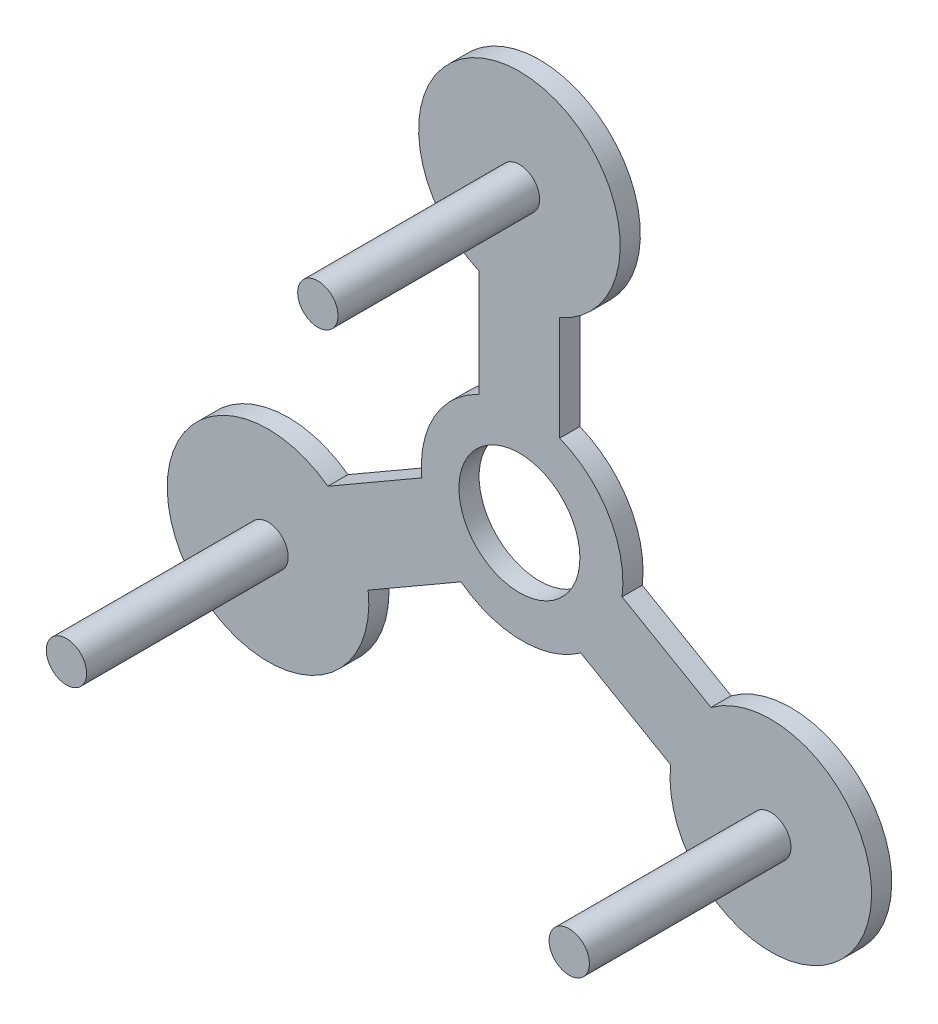
ISO-10303-21;
HEADER;
FILE_DESCRIPTION(('STEP AP214'),'2;1');
FILE_NAME('part.step','',(''),(''),'','','');
FILE_SCHEMA(('AUTOMOTIVE_DESIGN { 1 0 10303 214 1 1 1 1 }'));
ENDSEC;
DATA;
#1=APPLICATION_CONTEXT('core data for automotive mechanical design processes');
#2=APPLICATION_PROTOCOL_DEFINITION('international standard','automotive_design',2000,#1);
#3=PRODUCT_CONTEXT('',#1,'mechanical');
#4=PRODUCT('Part','Part','',(#3));
#5=PRODUCT_RELATED_PRODUCT_CATEGORY('part','',(#4));
#6=PRODUCT_DEFINITION_FORMATION('','',#4);
#7=PRODUCT_DEFINITION_CONTEXT('part definition',#1,'design');
#8=PRODUCT_DEFINITION('design','',#6,#7);
#9=PRODUCT_DEFINITION_SHAPE('','',#8);
#10=(LENGTH_UNIT() NAMED_UNIT(*) SI_UNIT(.MILLI.,.METRE.));
#11=(NAMED_UNIT(*) PLANE_ANGLE_UNIT() SI_UNIT($,.RADIAN.));
#12=(NAMED_UNIT(*) SI_UNIT($,.STERADIAN.) SOLID_ANGLE_UNIT());
#13=UNCERTAINTY_MEASURE_WITH_UNIT(LENGTH_MEASURE(1.E-05),#10,'distance_accuracy_value','');
#14=(GEOMETRIC_REPRESENTATION_CONTEXT(3) GLOBAL_UNCERTAINTY_ASSIGNED_CONTEXT((#13)) GLOBAL_UNIT_ASSIGNED_CONTEXT((#10,
#11,#12)) REPRESENTATION_CONTEXT('',''));
#15=CARTESIAN_POINT('',(0.,0.,0.));
#16=DIRECTION('',(0.,0.,1.));
#17=DIRECTION('',(1.,0.,0.));
#18=AXIS2_PLACEMENT_3D('',#15,#16,#17);
#19=CARTESIAN_POINT('',(0.116362959029001,28.8009743811257,33.5063190123971));
#20=DIRECTION('',(0.,0.,-1.));
#21=DIRECTION('',(-1.,0.,0.));
#22=AXIS2_PLACEMENT_3D('',#19,#20,#21);
#23=CYLINDRICAL_SURFACE('',#22,1.9999999999984);
#24=CARTESIAN_POINT('',(0.116362959029001,28.8009743811257,15.5063190123971));
#25=DIRECTION('',(0.,0.,1.));
#26=DIRECTION('',(1.,0.,0.));
#27=AXIS2_PLACEMENT_3D('',#24,#25,#26);
#28=CIRCLE('',#27,1.9999999999984);
#29=CARTESIAN_POINT('',(-1.8836370409694,28.8009743811257,15.5063190123971));
#30=VERTEX_POINT('',#29);
#31=EDGE_CURVE('E248',#30,#30,#28,.T.);
#32=CARTESIAN_POINT('',(0.116362959029001,28.8009743811257,35.5063190123971));
#33=DIRECTION('',(0.,0.,1.));
#34=DIRECTION('',(1.,0.,0.));
#35=AXIS2_PLACEMENT_3D('',#32,#33,#34);
#36=CIRCLE('',#35,1.9999999999984);
#37=CARTESIAN_POINT('',(-1.8836370409694,28.8009743811257,35.5063190123971));
#38=VERTEX_POINT('',#37);
#39=EDGE_CURVE('E236',#38,#38,#36,.T.);
#40=CARTESIAN_POINT('',(-1.8836370409694,28.8009743811257,15.5063190123971));
#41=CARTESIAN_POINT('',(-1.8836370409694,28.8009743811257,15.7146523457304));
#42=CARTESIAN_POINT('',(-1.8836370409694,28.8009743811257,15.9229856790638));
#43=CARTESIAN_POINT('',(-1.8836370409694,28.8009743811257,16.3396523457304));
#44=CARTESIAN_POINT('',(-1.8836370409694,28.8009743811257,16.5479856790638));
#45=CARTESIAN_POINT('',(-1.8836370409694,28.8009743811257,16.9646523457304));
#46=CARTESIAN_POINT('',(-1.8836370409694,28.8009743811257,17.1729856790638));
#47=CARTESIAN_POINT('',(-1.8836370409694,28.8009743811257,17.5896523457304));
#48=CARTESIAN_POINT('',(-1.8836370409694,28.8009743811257,17.7979856790638));
#49=CARTESIAN_POINT('',(-1.8836370409694,28.8009743811257,18.2146523457304));
#50=CARTESIAN_POINT('',(-1.8836370409694,28.8009743811257,18.4229856790638));
#51=CARTESIAN_POINT('',(-1.8836370409694,28.8009743811257,18.8396523457304));
#52=CARTESIAN_POINT('',(-1.8836370409694,28.8009743811257,19.0479856790638));
#53=CARTESIAN_POINT('',(-1.8836370409694,28.8009743811257,19.4646523457304));
#54=CARTESIAN_POINT('',(-1.8836370409694,28.8009743811257,19.6729856790638));
#55=CARTESIAN_POINT('',(-1.8836370409694,28.8009743811257,20.0896523457304));
#56=CARTESIAN_POINT('',(-1.8836370409694,28.8009743811257,20.2979856790638));
#57=CARTESIAN_POINT('',(-1.8836370409694,28.8009743811257,20.7146523457304));
#58=CARTESIAN_POINT('',(-1.8836370409694,28.8009743811257,20.9229856790638));
#59=CARTESIAN_POINT('',(-1.8836370409694,28.8009743811257,21.3396523457304));
#60=CARTESIAN_POINT('',(-1.8836370409694,28.8009743811257,21.5479856790638));
#61=CARTESIAN_POINT('',(-1.8836370409694,28.8009743811257,21.9646523457304));
#62=CARTESIAN_POINT('',(-1.8836370409694,28.8009743811257,22.1729856790638));
#63=CARTESIAN_POINT('',(-1.8836370409694,28.8009743811257,22.5896523457304));
#64=CARTESIAN_POINT('',(-1.8836370409694,28.8009743811257,22.7979856790638));
#65=CARTESIAN_POINT('',(-1.8836370409694,28.8009743811257,23.2146523457304));
#66=CARTESIAN_POINT('',(-1.8836370409694,28.8009743811257,23.4229856790638));
#67=CARTESIAN_POINT('',(-1.8836370409694,28.8009743811257,23.8396523457304));
#68=CARTESIAN_POINT('',(-1.8836370409694,28.8009743811257,24.0479856790638));
#69=CARTESIAN_POINT('',(-1.8836370409694,28.8009743811257,24.4646523457304));
#70=CARTESIAN_POINT('',(-1.8836370409694,28.8009743811257,24.6729856790638));
#71=CARTESIAN_POINT('',(-1.8836370409694,28.8009743811257,25.0896523457304));
#72=CARTESIAN_POINT('',(-1.8836370409694,28.8009743811257,25.2979856790638));
#73=CARTESIAN_POINT('',(-1.8836370409694,28.8009743811257,25.7146523457304));
#74=CARTESIAN_POINT('',(-1.8836370409694,28.8009743811257,25.9229856790638));
#75=CARTESIAN_POINT('',(-1.8836370409694,28.8009743811257,26.3396523457304));
#76=CARTESIAN_POINT('',(-1.8836370409694,28.8009743811257,26.5479856790638));
#77=CARTESIAN_POINT('',(-1.8836370409694,28.8009743811257,26.9646523457304));
#78=CARTESIAN_POINT('',(-1.8836370409694,28.8009743811257,27.1729856790638));
#79=CARTESIAN_POINT('',(-1.8836370409694,28.8009743811257,27.5896523457304));
#80=CARTESIAN_POINT('',(-1.8836370409694,28.8009743811257,27.7979856790638));
#81=CARTESIAN_POINT('',(-1.8836370409694,28.8009743811257,28.2146523457304));
#82=CARTESIAN_POINT('',(-1.8836370409694,28.8009743811257,28.4229856790638));
#83=CARTESIAN_POINT('',(-1.8836370409694,28.8009743811257,28.8396523457304));
#84=CARTESIAN_POINT('',(-1.8836370409694,28.8009743811257,29.0479856790638));
#85=CARTESIAN_POINT('',(-1.8836370409694,28.8009743811257,29.4646523457304));
#86=CARTESIAN_POINT('',(-1.8836370409694,28.8009743811257,29.6729856790638));
#87=CARTESIAN_POINT('',(-1.8836370409694,28.8009743811257,30.0896523457304));
#88=CARTESIAN_POINT('',(-1.8836370409694,28.8009743811257,30.2979856790638));
#89=CARTESIAN_POINT('',(-1.8836370409694,28.8009743811257,30.7146523457304));
#90=CARTESIAN_POINT('',(-1.8836370409694,28.8009743811257,30.9229856790638));
#91=CARTESIAN_POINT('',(-1.8836370409694,28.8009743811257,31.3396523457304));
#92=CARTESIAN_POINT('',(-1.8836370409694,28.8009743811257,31.5479856790638));
#93=CARTESIAN_POINT('',(-1.8836370409694,28.8009743811257,31.9646523457304));
#94=CARTESIAN_POINT('',(-1.8836370409694,28.8009743811257,32.1729856790638));
#95=CARTESIAN_POINT('',(-1.8836370409694,28.8009743811257,32.5896523457304));
#96=CARTESIAN_POINT('',(-1.8836370409694,28.8009743811257,32.7979856790638));
#97=CARTESIAN_POINT('',(-1.8836370409694,28.8009743811257,33.2146523457304));
#98=CARTESIAN_POINT('',(-1.8836370409694,28.8009743811257,33.4229856790638));
#99=CARTESIAN_POINT('',(-1.8836370409694,28.8009743811257,33.8396523457304));
#100=CARTESIAN_POINT('',(-1.8836370409694,28.8009743811257,34.0479856790638));
#101=CARTESIAN_POINT('',(-1.8836370409694,28.8009743811257,34.4646523457304));
#102=CARTESIAN_POINT('',(-1.8836370409694,28.8009743811257,34.6729856790638));
#103=CARTESIAN_POINT('',(-1.8836370409694,28.8009743811257,35.0896523457304));
#104=CARTESIAN_POINT('',(-1.8836370409694,28.8009743811257,35.2979856790638));
#105=CARTESIAN_POINT('',(-1.8836370409694,28.8009743811257,35.5063190123971));
#106=B_SPLINE_CURVE_WITH_KNOTS('',3,(#40,#41,#42,#43,#44,#45,#46,#47,#48,#49,#50,#51,#52,#53,
#54,#55,#56,#57,#58,#59,#60,#61,#62,#63,#64,#65,#66,#67,#68,#69,#70,#71,#72,#73,#74,#75,#76,#77,
#78,#79,#80,#81,#82,#83,#84,#85,#86,#87,#88,#89,#90,#91,#92,#93,#94,#95,#96,#97,#98,#99,#100,
#101,#102,#103,#104,#105),.UNSPECIFIED.,.F.,.F.,(4,2,2,2,2,2,2,2,2,2,2,2,2,2,2,2,2,2,2,2,2,2,2,
2,2,2,2,2,2,2,2,2,4),(0.,0.625000000000001,1.25,1.875,2.5,3.125,3.75,4.375,5.,5.625,6.25,6.875,
7.5,8.125,8.75,9.375,10.,10.625,11.25,11.875,12.5,13.125,13.75,14.375,15.,15.625,16.25,16.875,
17.5,18.125,18.75,19.375,20.),.UNSPECIFIED.);
#107=EDGE_CURVE('BSEAM38',#30,#38,#106,.T.);
#108=ORIENTED_EDGE('',*,*,#31,.T.);
#109=ORIENTED_EDGE('',*,*,#39,.F.);
#110=ORIENTED_EDGE('',*,*,#107,.T.);
#111=ORIENTED_EDGE('',*,*,#107,.F.);
#112=EDGE_LOOP('',(#108,#110,#109,#111));
#113=FACE_BOUND('',#112,.T.);
#114=ADVANCED_FACE('F38',(#113),#23,.T.);
#115=CARTESIAN_POINT('',(-3.883637040973,2.31037545788538,15.5063190123971));
#116=DIRECTION('',(1.,0.,0.));
#117=DIRECTION('',(0.,0.,-1.));
#118=AXIS2_PLACEMENT_3D('',#115,#116,#117);
#119=PLANE('',#118);
#120=DIRECTION('',(0.,-1.,0.));
#121=VECTOR('',#120,1.);
#122=CARTESIAN_POINT('',(-3.883637040973,2.31037545788538,13.5063190123971));
#123=LINE('',#122,#121);
#124=CARTESIAN_POINT('',(-3.883637040973,19.6358229912151,13.5063190123971));
#125=VERTEX_POINT('',#124);
#126=CARTESIAN_POINT('',(-3.883637040973,9.04530242676487,13.5063190123971));
#127=VERTEX_POINT('',#126);
#128=EDGE_CURVE('E143',#125,#127,#123,.T.);
#129=ORIENTED_EDGE('',*,*,#128,.T.);
#130=DIRECTION('',(0.,0.,1.));
#131=VECTOR('',#130,1.);
#132=CARTESIAN_POINT('',(-3.883637040973,9.04530242676487,13.5063190123971));
#133=LINE('',#132,#131);
#134=CARTESIAN_POINT('',(-3.883637040973,9.04530242676487,15.5063190123971));
#135=VERTEX_POINT('',#134);
#136=EDGE_CURVE('E128',#127,#135,#133,.T.);
#137=ORIENTED_EDGE('',*,*,#136,.T.);
#138=DIRECTION('',(0.,-1.,0.));
#139=VECTOR('',#138,1.);
#140=CARTESIAN_POINT('',(-3.883637040973,2.31037545788538,15.5063190123971));
#141=LINE('',#140,#139);
#142=CARTESIAN_POINT('',(-3.883637040973,19.6358229912151,15.5063190123971));
#143=VERTEX_POINT('',#142);
#144=EDGE_CURVE('E141',#143,#135,#141,.T.);
#145=ORIENTED_EDGE('',*,*,#144,.F.);
#146=DIRECTION('',(0.,0.,1.));
#147=VECTOR('',#146,1.);
#148=CARTESIAN_POINT('',(-3.883637040973,19.6358229912151,13.5063190123971));
#149=LINE('',#148,#147);
#150=EDGE_CURVE('E272',#143,#125,#149,.F.);
#151=ORIENTED_EDGE('',*,*,#150,.T.);
#152=EDGE_LOOP('',(#129,#137,#145,#151));
#153=FACE_BOUND('',#152,.T.);
#154=ADVANCED_FACE('F40',(#153),#119,.F.);
#155=CARTESIAN_POINT('',(-26.8251686699649,-10.9349240037355,15.5063190123971));
#156=DIRECTION('',(0.500000000000004,-0.866025403784436,0.));
#157=DIRECTION('',(0.866025403784436,0.500000000000004,0.));
#158=AXIS2_PLACEMENT_3D('',#155,#156,#157);
#159=PLANE('',#158);
#160=DIRECTION('',(-0.866025403784436,-0.500000000000004,0.));
#161=VECTOR('',#160,1.);
#162=CARTESIAN_POINT('',(-26.8251686699649,-10.9349240037355,15.5063190123971));
#163=LINE('',#162,#161);
#164=CARTESIAN_POINT('',(-9.56996793087543,-0.972629212101116,15.5063190123971));
#165=VERTEX_POINT('',#164);
#166=CARTESIAN_POINT('',(-18.8879147367711,-6.35234830877965,15.5063190123971));
#167=VERTEX_POINT('',#166);
#168=EDGE_CURVE('E153',#165,#167,#163,.T.);
#169=ORIENTED_EDGE('',*,*,#168,.F.);
#170=DIRECTION('',(0.,0.,1.));
#171=VECTOR('',#170,1.);
#172=CARTESIAN_POINT('',(-9.56996793087544,-0.972629212101116,13.5063190123971));
#173=LINE('',#172,#171);
#174=CARTESIAN_POINT('',(-9.56996793087544,-0.972629212101116,13.5063190123971));
#175=VERTEX_POINT('',#174);
#176=EDGE_CURVE('E131',#165,#175,#173,.F.);
#177=ORIENTED_EDGE('',*,*,#176,.T.);
#178=DIRECTION('',(-0.866025403784436,-0.500000000000004,0.));
#179=VECTOR('',#178,1.);
#180=CARTESIAN_POINT('',(-26.8251686699649,-10.9349240037355,13.5063190123971));
#181=LINE('',#180,#179);
#182=CARTESIAN_POINT('',(-18.8879147367711,-6.35234830877965,13.5063190123971));
#183=VERTEX_POINT('',#182);
#184=EDGE_CURVE('E174',#175,#183,#181,.T.);
#185=ORIENTED_EDGE('',*,*,#184,.T.);
#186=DIRECTION('',(0.,0.,1.));
#187=VECTOR('',#186,1.);
#188=CARTESIAN_POINT('',(-18.8879147367711,-6.35234830877965,13.5063190123971));
#189=LINE('',#188,#187);
#190=EDGE_CURVE('E161',#183,#167,#189,.T.);
#191=ORIENTED_EDGE('',*,*,#190,.T.);
#192=EDGE_LOOP('',(#169,#177,#185,#191));
#193=FACE_BOUND('',#192,.T.);
#194=ADVANCED_FACE('F291',(#193),#159,.F.);
#195=CARTESIAN_POINT('',(0.116362959027002,-4.61782777239012,15.5063190123971));
#196=DIRECTION('',(-0.500000000000005,0.866025403784436,0.));
#197=DIRECTION('',(-0.866025403784436,-0.500000000000005,0.));
#198=AXIS2_PLACEMENT_3D('',#195,#196,#197);
#199=PLANE('',#198);
#200=DIRECTION('',(0.866025403784436,0.500000000000004,0.));
#201=VECTOR('',#200,1.);
#202=CARTESIAN_POINT('',(0.116362959027002,-4.61782777239012,13.5063190123971));
#203=LINE('',#202,#201);
#204=CARTESIAN_POINT('',(-14.8879147367711,-13.2805515390551,13.5063190123971));
#205=VERTEX_POINT('',#204);
#206=CARTESIAN_POINT('',(-5.67057998424895,-7.95892083847554,13.5063190123971));
#207=VERTEX_POINT('',#206);
#208=EDGE_CURVE('E177',#205,#207,#203,.T.);
#209=ORIENTED_EDGE('',*,*,#208,.T.);
#210=DIRECTION('',(0.,0.,1.));
#211=VECTOR('',#210,1.);
#212=CARTESIAN_POINT('',(-5.67057998424895,-7.95892083847554,13.5063190123971));
#213=LINE('',#212,#211);
#214=CARTESIAN_POINT('',(-5.67057998424895,-7.95892083847554,15.5063190123971));
#215=VERTEX_POINT('',#214);
#216=EDGE_CURVE('E223',#207,#215,#213,.T.);
#217=ORIENTED_EDGE('',*,*,#216,.T.);
#218=DIRECTION('',(0.866025403784436,0.500000000000004,0.));
#219=VECTOR('',#218,1.);
#220=CARTESIAN_POINT('',(0.116362959027002,-4.61782777239012,15.5063190123971));
#221=LINE('',#220,#219);
#222=CARTESIAN_POINT('',(-14.8879147367711,-13.2805515390551,15.5063190123971));
#223=VERTEX_POINT('',#222);
#224=EDGE_CURVE('E157',#223,#215,#221,.T.);
#225=ORIENTED_EDGE('',*,*,#224,.F.);
#226=DIRECTION('',(0.,0.,1.));
#227=VECTOR('',#226,1.);
#228=CARTESIAN_POINT('',(-14.8879147367711,-13.2805515390551,13.5063190123971));
#229=LINE('',#228,#227);
#230=EDGE_CURVE('E279',#223,#205,#229,.F.);
#231=ORIENTED_EDGE('',*,*,#230,.T.);
#232=EDGE_LOOP('',(#209,#217,#225,#231));
#233=FACE_BOUND('',#232,.T.);
#234=ADVANCED_FACE('F298',(#233),#199,.F.);
#235=CARTESIAN_POINT('',(23.0578945880189,-17.863127234011,15.5063190123971));
#236=DIRECTION('',(0.500000000000004,0.866025403784436,0.));
#237=DIRECTION('',(-0.866025403784436,0.500000000000004,0.));
#238=AXIS2_PLACEMENT_3D('',#235,#236,#237);
#239=PLANE('',#238);
#240=DIRECTION('',(0.866025403784436,-0.500000000000004,0.));
#241=VECTOR('',#240,1.);
#242=CARTESIAN_POINT('',(23.0578945880189,-17.863127234011,15.5063190123971));
#243=LINE('',#242,#241);
#244=CARTESIAN_POINT('',(6.20193544121898,-8.13133468315668,15.5063190123971));
#245=VERTEX_POINT('',#244);
#246=CARTESIAN_POINT('',(15.120640654825,-13.2805515390551,15.5063190123971));
#247=VERTEX_POINT('',#246);
#248=EDGE_CURVE('E167',#245,#247,#243,.T.);
#249=ORIENTED_EDGE('',*,*,#248,.F.);
#250=DIRECTION('',(0.,0.,1.));
#251=VECTOR('',#250,1.);
#252=CARTESIAN_POINT('',(6.20193544121898,-8.13133468315668,13.5063190123971));
#253=LINE('',#252,#251);
#254=CARTESIAN_POINT('',(6.20193544121898,-8.13133468315668,13.5063190123971));
#255=VERTEX_POINT('',#254);
#256=EDGE_CURVE('E217',#245,#255,#253,.F.);
#257=ORIENTED_EDGE('',*,*,#256,.T.);
#258=DIRECTION('',(0.866025403784436,-0.500000000000004,0.));
#259=VECTOR('',#258,1.);
#260=CARTESIAN_POINT('',(23.0578945880189,-17.863127234011,13.5063190123971));
#261=LINE('',#260,#259);
#262=CARTESIAN_POINT('',(15.120640654825,-13.2805515390551,13.5063190123971));
#263=VERTEX_POINT('',#262);
#264=EDGE_CURVE('E181',#255,#263,#261,.T.);
#265=ORIENTED_EDGE('',*,*,#264,.T.);
#266=DIRECTION('',(0.,0.,1.));
#267=VECTOR('',#266,1.);
#268=CARTESIAN_POINT('',(15.120640654825,-13.2805515390551,13.5063190123971));
#269=LINE('',#268,#267);
#270=EDGE_CURVE('E259',#263,#247,#269,.T.);
#271=ORIENTED_EDGE('',*,*,#270,.T.);
#272=EDGE_LOOP('',(#249,#257,#265,#271));
#273=FACE_BOUND('',#272,.T.);
#274=ADVANCED_FACE('F306',(#273),#239,.F.);
#275=CARTESIAN_POINT('',(4.116362959027,2.31037545788538,15.5063190123971));
#276=DIRECTION('',(-0.500000000000004,-0.866025403784436,0.));
#277=DIRECTION('',(0.866025403784436,-0.500000000000004,0.));
#278=AXIS2_PLACEMENT_3D('',#275,#276,#277);
#279=PLANE('',#278);
#280=DIRECTION('',(-0.866025403784436,0.500000000000004,0.));
#281=VECTOR('',#280,1.);
#282=CARTESIAN_POINT('',(4.116362959027,2.31037545788538,13.5063190123971));
#283=LINE('',#282,#281);
#284=CARTESIAN_POINT('',(19.1206406548252,-6.35234830877971,13.5063190123971));
#285=VERTEX_POINT('',#284);
#286=CARTESIAN_POINT('',(10.3025474945923,-1.26121984898001,13.5063190123971));
#287=VERTEX_POINT('',#286);
#288=EDGE_CURVE('E159',#285,#287,#283,.T.);
#289=ORIENTED_EDGE('',*,*,#288,.T.);
#290=DIRECTION('',(0.,0.,1.));
#291=VECTOR('',#290,1.);
#292=CARTESIAN_POINT('',(10.3025474945923,-1.26121984898001,13.5063190123971));
#293=LINE('',#292,#291);
#294=CARTESIAN_POINT('',(10.3025474945923,-1.26121984898001,15.5063190123971));
#295=VERTEX_POINT('',#294);
#296=EDGE_CURVE('E191',#287,#295,#293,.T.);
#297=ORIENTED_EDGE('',*,*,#296,.T.);
#298=DIRECTION('',(-0.866025403784436,0.500000000000004,0.));
#299=VECTOR('',#298,1.);
#300=CARTESIAN_POINT('',(4.116362959027,2.31037545788538,15.5063190123971));
#301=LINE('',#300,#299);
#302=CARTESIAN_POINT('',(19.1206406548252,-6.35234830877971,15.5063190123971));
#303=VERTEX_POINT('',#302);
#304=EDGE_CURVE('E48',#303,#295,#301,.T.);
#305=ORIENTED_EDGE('',*,*,#304,.F.);
#306=DIRECTION('',(0.,0.,1.));
#307=VECTOR('',#306,1.);
#308=CARTESIAN_POINT('',(19.1206406548252,-6.35234830877971,13.5063190123971));
#309=LINE('',#308,#307);
#310=EDGE_CURVE('E193',#303,#285,#309,.F.);
#311=ORIENTED_EDGE('',*,*,#310,.T.);
#312=EDGE_LOOP('',(#289,#297,#305,#311));
#313=FACE_BOUND('',#312,.T.);
#314=ADVANCED_FACE('F189',(#313),#279,.F.);
#315=CARTESIAN_POINT('',(4.116362959027,28.8009743811267,15.5063190123971));
#316=DIRECTION('',(-1.,0.,0.));
#317=DIRECTION('',(0.,0.,1.));
#318=AXIS2_PLACEMENT_3D('',#315,#316,#317);
#319=PLANE('',#318);
#320=DIRECTION('',(0.,1.,0.));
#321=VECTOR('',#320,1.);
#322=CARTESIAN_POINT('',(4.116362959027,28.8009743811267,15.5063190123971));
#323=LINE('',#322,#321);
#324=CARTESIAN_POINT('',(4.116362959027,9.27774358066691,15.5063190123971));
#325=VERTEX_POINT('',#324);
#326=CARTESIAN_POINT('',(4.116362959027,19.635822991215,15.5063190123971));
#327=VERTEX_POINT('',#326);
#328=EDGE_CURVE('E11',#325,#327,#323,.T.);
#329=ORIENTED_EDGE('',*,*,#328,.F.);
#330=DIRECTION('',(0.,0.,1.));
#331=VECTOR('',#330,1.);
#332=CARTESIAN_POINT('',(4.116362959027,9.27774358066691,13.5063190123971));
#333=LINE('',#332,#331);
#334=CARTESIAN_POINT('',(4.116362959027,9.27774358066691,13.5063190123971));
#335=VERTEX_POINT('',#334);
#336=EDGE_CURVE('E211',#325,#335,#333,.F.);
#337=ORIENTED_EDGE('',*,*,#336,.T.);
#338=DIRECTION('',(0.,1.,0.));
#339=VECTOR('',#338,1.);
#340=CARTESIAN_POINT('',(4.116362959027,28.8009743811267,13.5063190123971));
#341=LINE('',#340,#339);
#342=CARTESIAN_POINT('',(4.116362959027,19.635822991215,13.5063190123971));
#343=VERTEX_POINT('',#342);
#344=EDGE_CURVE('E42',#335,#343,#341,.T.);
#345=ORIENTED_EDGE('',*,*,#344,.T.);
#346=DIRECTION('',(0.,0.,1.));
#347=VECTOR('',#346,1.);
#348=CARTESIAN_POINT('',(4.116362959027,19.635822991215,13.5063190123971));
#349=LINE('',#348,#347);
#350=EDGE_CURVE('E266',#343,#327,#349,.T.);
#351=ORIENTED_EDGE('',*,*,#350,.T.);
#352=EDGE_LOOP('',(#329,#337,#345,#351));
#353=FACE_BOUND('',#352,.T.);
#354=ADVANCED_FACE('F374',(#353),#319,.F.);
#355=CARTESIAN_POINT('',(0.116362959027002,0.000974381126719212,15.5063190123971));
#356=DIRECTION('',(0.,0.,1.));
#357=DIRECTION('',(1.,0.,0.));
#358=AXIS2_PLACEMENT_3D('',#355,#356,#357);
#359=PLANE('',#358);
#360=CARTESIAN_POINT('',(0.116362959027002,0.000974381126719212,15.5063190123971));
#361=DIRECTION('',(0.,0.,1.));
#362=DIRECTION('',(1.,0.,0.));
#363=AXIS2_PLACEMENT_3D('',#360,#361,#362);
#364=CIRCLE('',#363,6.);
#365=CARTESIAN_POINT('',(6.116362959027,0.000974381126719212,15.5063190123971));
#366=VERTEX_POINT('',#365);
#367=EDGE_CURVE('E360',#366,#366,#364,.T.);
#368=ORIENTED_EDGE('',*,*,#367,.F.);
#369=EDGE_LOOP('',(#368));
#370=FACE_BOUND('',#369,.T.);
#371=ORIENTED_EDGE('',*,*,#304,.T.);
#372=CARTESIAN_POINT('',(0.382524020553306,0.000974381126719212,15.5063190123971));
#373=DIRECTION('',(0.,0.,1.));
#374=DIRECTION('',(1.,0.,0.));
#375=AXIS2_PLACEMENT_3D('',#372,#373,#374);
#376=CIRCLE('',#375,10.);
#377=EDGE_CURVE('E62',#295,#325,#376,.T.);
#378=ORIENTED_EDGE('',*,*,#377,.T.);
#379=ORIENTED_EDGE('',*,*,#328,.T.);
#380=CARTESIAN_POINT('',(0.116362959027143,28.8009743811267,15.5063190123971));
#381=DIRECTION('',(0.,0.,1.));
#382=DIRECTION('',(1.,0.,0.));
#383=AXIS2_PLACEMENT_3D('',#380,#381,#382);
#384=CIRCLE('',#383,10.);
#385=EDGE_CURVE('E151',#327,#143,#384,.T.);
#386=ORIENTED_EDGE('',*,*,#385,.T.);
#387=ORIENTED_EDGE('',*,*,#144,.T.);
#388=EDGE_CURVE('E56',#135,#165,#376,.T.);
#389=ORIENTED_EDGE('',*,*,#388,.T.);
#390=ORIENTED_EDGE('',*,*,#168,.T.);
#391=CARTESIAN_POINT('',(-24.8251686699648,-14.3990256188733,15.5063190123971));
#392=DIRECTION('',(0.,0.,1.));
#393=DIRECTION('',(1.,0.,0.));
#394=AXIS2_PLACEMENT_3D('',#391,#392,#393);
#395=CIRCLE('',#394,10.);
#396=EDGE_CURVE('E275',#167,#223,#395,.T.);
#397=ORIENTED_EDGE('',*,*,#396,.T.);
#398=ORIENTED_EDGE('',*,*,#224,.T.);
#399=EDGE_CURVE('E135',#215,#245,#376,.T.);
#400=ORIENTED_EDGE('',*,*,#399,.T.);
#401=ORIENTED_EDGE('',*,*,#248,.T.);
#402=CARTESIAN_POINT('',(25.0578945880187,-14.3990256188735,15.5063190123971));
#403=DIRECTION('',(0.,0.,1.));
#404=DIRECTION('',(1.,0.,0.));
#405=AXIS2_PLACEMENT_3D('',#402,#403,#404);
#406=CIRCLE('',#405,10.);
#407=EDGE_CURVE('E252',#247,#303,#406,.T.);
#408=ORIENTED_EDGE('',*,*,#407,.T.);
#409=EDGE_LOOP('',(#371,#378,#379,#386,#387,#389,#390,#397,#398,#400,#401,#408));
#410=FACE_BOUND('',#409,.T.);
#411=CARTESIAN_POINT('',(25.0578945880188,-14.3990256188734,15.5063190123971));
#412=DIRECTION('',(0.,0.,1.));
#413=DIRECTION('',(1.,0.,0.));
#414=AXIS2_PLACEMENT_3D('',#411,#412,#413);
#415=CIRCLE('',#414,2.);
#416=CARTESIAN_POINT('',(23.0578945880188,-14.3990256188734,15.5063190123971));
#417=VERTEX_POINT('',#416);
#418=EDGE_CURVE('E244',#417,#417,#415,.T.);
#419=ORIENTED_EDGE('',*,*,#418,.F.);
#420=EDGE_LOOP('',(#419));
#421=FACE_BOUND('',#420,.T.);
#422=CARTESIAN_POINT('',(-24.8251686699631,-14.3990256188721,15.5063190123971));
#423=DIRECTION('',(0.,0.,1.));
#424=DIRECTION('',(1.,0.,0.));
#425=AXIS2_PLACEMENT_3D('',#422,#423,#424);
#426=CIRCLE('',#425,2.00000000000073);
#427=CARTESIAN_POINT('',(-26.8251686699638,-14.3990256188721,15.5063190123971));
#428=VERTEX_POINT('',#427);
#429=EDGE_CURVE('E240',#428,#428,#426,.T.);
#430=ORIENTED_EDGE('',*,*,#429,.F.);
#431=EDGE_LOOP('',(#430));
#432=FACE_BOUND('',#431,.T.);
#433=ORIENTED_EDGE('',*,*,#31,.F.);
#434=EDGE_LOOP('',(#433));
#435=FACE_BOUND('',#434,.T.);
#436=ADVANCED_FACE('F148',(#370,#410,#421,#432,#435),#359,.T.);
#437=CARTESIAN_POINT('',(0.116362959027002,0.000974381126719212,13.5063190123971));
#438=DIRECTION('',(0.,0.,1.));
#439=DIRECTION('',(1.,0.,0.));
#440=AXIS2_PLACEMENT_3D('',#437,#438,#439);
#441=PLANE('',#440);
#442=CARTESIAN_POINT('',(0.116362959027002,0.000974381126719212,13.5063190123971));
#443=DIRECTION('',(0.,0.,1.));
#444=DIRECTION('',(1.,0.,0.));
#445=AXIS2_PLACEMENT_3D('',#442,#443,#444);
#446=CIRCLE('',#445,6.);
#447=CARTESIAN_POINT('',(6.116362959027,0.000974381126719212,13.5063190123971));
#448=VERTEX_POINT('',#447);
#449=EDGE_CURVE('E357',#448,#448,#446,.T.);
#450=ORIENTED_EDGE('',*,*,#449,.T.);
#451=EDGE_LOOP('',(#450));
#452=FACE_BOUND('',#451,.T.);
#453=ORIENTED_EDGE('',*,*,#264,.F.);
#454=CARTESIAN_POINT('',(0.382524020553306,0.000974381126719212,13.5063190123971));
#455=DIRECTION('',(0.,0.,1.));
#456=DIRECTION('',(1.,0.,0.));
#457=AXIS2_PLACEMENT_3D('',#454,#455,#456);
#458=CIRCLE('',#457,10.);
#459=EDGE_CURVE('E205',#207,#255,#458,.T.);
#460=ORIENTED_EDGE('',*,*,#459,.F.);
#461=ORIENTED_EDGE('',*,*,#208,.F.);
#462=CARTESIAN_POINT('',(-24.8251686699648,-14.3990256188733,13.5063190123971));
#463=DIRECTION('',(0.,0.,1.));
#464=DIRECTION('',(1.,0.,0.));
#465=AXIS2_PLACEMENT_3D('',#462,#463,#464);
#466=CIRCLE('',#465,10.);
#467=EDGE_CURVE('E276',#183,#205,#466,.T.);
#468=ORIENTED_EDGE('',*,*,#467,.F.);
#469=ORIENTED_EDGE('',*,*,#184,.F.);
#470=EDGE_CURVE('E207',#127,#175,#458,.T.);
#471=ORIENTED_EDGE('',*,*,#470,.F.);
#472=ORIENTED_EDGE('',*,*,#128,.F.);
#473=CARTESIAN_POINT('',(0.116362959027143,28.8009743811267,13.5063190123971));
#474=DIRECTION('',(0.,0.,1.));
#475=DIRECTION('',(1.,0.,0.));
#476=AXIS2_PLACEMENT_3D('',#473,#474,#475);
#477=CIRCLE('',#476,10.);
#478=EDGE_CURVE('E263',#343,#125,#477,.T.);
#479=ORIENTED_EDGE('',*,*,#478,.F.);
#480=ORIENTED_EDGE('',*,*,#344,.F.);
#481=EDGE_CURVE('E134',#287,#335,#458,.T.);
#482=ORIENTED_EDGE('',*,*,#481,.F.);
#483=ORIENTED_EDGE('',*,*,#288,.F.);
#484=CARTESIAN_POINT('',(25.0578945880187,-14.3990256188735,13.5063190123971));
#485=DIRECTION('',(0.,0.,1.));
#486=DIRECTION('',(1.,0.,0.));
#487=AXIS2_PLACEMENT_3D('',#484,#485,#486);
#488=CIRCLE('',#487,10.);
#489=EDGE_CURVE('E199',#263,#285,#488,.T.);
#490=ORIENTED_EDGE('',*,*,#489,.F.);
#491=EDGE_LOOP('',(#453,#460,#461,#468,#469,#471,#472,#479,#480,#482,#483,#490));
#492=FACE_BOUND('',#491,.T.);
#493=ADVANCED_FACE('F198',(#452,#492),#441,.F.);
#494=CARTESIAN_POINT('',(-24.8251686699648,-14.3990256188733,13.5063190123971));
#495=DIRECTION('',(0.,0.,1.));
#496=DIRECTION('',(1.,0.,0.));
#497=AXIS2_PLACEMENT_3D('',#494,#495,#496);
#498=CYLINDRICAL_SURFACE('',#497,10.);
#499=ORIENTED_EDGE('',*,*,#190,.F.);
#500=ORIENTED_EDGE('',*,*,#467,.T.);
#501=ORIENTED_EDGE('',*,*,#230,.F.);
#502=ORIENTED_EDGE('',*,*,#396,.F.);
#503=EDGE_LOOP('',(#499,#500,#501,#502));
#504=FACE_BOUND('',#503,.T.);
#505=ADVANCED_FACE('F296',(#504),#498,.T.);
#506=CARTESIAN_POINT('',(0.116362959027143,28.8009743811267,13.5063190123971));
#507=DIRECTION('',(0.,0.,1.));
#508=DIRECTION('',(1.,0.,0.));
#509=AXIS2_PLACEMENT_3D('',#506,#507,#508);
#510=CYLINDRICAL_SURFACE('',#509,10.);
#511=ORIENTED_EDGE('',*,*,#150,.F.);
#512=ORIENTED_EDGE('',*,*,#385,.F.);
#513=ORIENTED_EDGE('',*,*,#350,.F.);
#514=ORIENTED_EDGE('',*,*,#478,.T.);
#515=EDGE_LOOP('',(#511,#512,#513,#514));
#516=FACE_BOUND('',#515,.T.);
#517=ADVANCED_FACE('F312',(#516),#510,.T.);
#518=CARTESIAN_POINT('',(25.0578945880187,-14.3990256188735,13.5063190123971));
#519=DIRECTION('',(0.,0.,1.));
#520=DIRECTION('',(1.,0.,0.));
#521=AXIS2_PLACEMENT_3D('',#518,#519,#520);
#522=CYLINDRICAL_SURFACE('',#521,10.);
#523=ORIENTED_EDGE('',*,*,#270,.F.);
#524=ORIENTED_EDGE('',*,*,#489,.T.);
#525=ORIENTED_EDGE('',*,*,#310,.F.);
#526=ORIENTED_EDGE('',*,*,#407,.F.);
#527=EDGE_LOOP('',(#523,#524,#525,#526));
#528=FACE_BOUND('',#527,.T.);
#529=ADVANCED_FACE('F309',(#528),#522,.T.);
#530=CARTESIAN_POINT('',(25.0578945880188,-14.3990256188734,33.5063190123971));
#531=DIRECTION('',(0.,0.,-1.));
#532=DIRECTION('',(-1.,0.,0.));
#533=AXIS2_PLACEMENT_3D('',#530,#531,#532);
#534=CYLINDRICAL_SURFACE('',#533,2.);
#535=CARTESIAN_POINT('',(25.0578945880188,-14.3990256188734,35.5063190123971));
#536=DIRECTION('',(0.,0.,1.));
#537=DIRECTION('',(1.,0.,0.));
#538=AXIS2_PLACEMENT_3D('',#535,#536,#537);
#539=CIRCLE('',#538,2.);
#540=CARTESIAN_POINT('',(23.0578945880188,-14.3990256188734,35.5063190123971));
#541=VERTEX_POINT('',#540);
#542=EDGE_CURVE('E145',#541,#541,#539,.T.);
#543=CARTESIAN_POINT('',(23.0578945880188,-14.3990256188734,15.5063190123971));
#544=CARTESIAN_POINT('',(23.0578945880188,-14.3990256188734,15.7146523457304));
#545=CARTESIAN_POINT('',(23.0578945880188,-14.3990256188734,15.9229856790638));
#546=CARTESIAN_POINT('',(23.0578945880188,-14.3990256188734,16.3396523457304));
#547=CARTESIAN_POINT('',(23.0578945880188,-14.3990256188734,16.5479856790638));
#548=CARTESIAN_POINT('',(23.0578945880188,-14.3990256188734,16.9646523457304));
#549=CARTESIAN_POINT('',(23.0578945880188,-14.3990256188734,17.1729856790638));
#550=CARTESIAN_POINT('',(23.0578945880188,-14.3990256188734,17.5896523457304));
#551=CARTESIAN_POINT('',(23.0578945880188,-14.3990256188734,17.7979856790638));
#552=CARTESIAN_POINT('',(23.0578945880188,-14.3990256188734,18.2146523457304));
#553=CARTESIAN_POINT('',(23.0578945880188,-14.3990256188734,18.4229856790638));
#554=CARTESIAN_POINT('',(23.0578945880188,-14.3990256188734,18.8396523457304));
#555=CARTESIAN_POINT('',(23.0578945880188,-14.3990256188734,19.0479856790638));
#556=CARTESIAN_POINT('',(23.0578945880188,-14.3990256188734,19.4646523457304));
#557=CARTESIAN_POINT('',(23.0578945880188,-14.3990256188734,19.6729856790638));
#558=CARTESIAN_POINT('',(23.0578945880188,-14.3990256188734,20.0896523457304));
#559=CARTESIAN_POINT('',(23.0578945880188,-14.3990256188734,20.2979856790638));
#560=CARTESIAN_POINT('',(23.0578945880188,-14.3990256188734,20.7146523457304));
#561=CARTESIAN_POINT('',(23.0578945880188,-14.3990256188734,20.9229856790638));
#562=CARTESIAN_POINT('',(23.0578945880188,-14.3990256188734,21.3396523457304));
#563=CARTESIAN_POINT('',(23.0578945880188,-14.3990256188734,21.5479856790638));
#564=CARTESIAN_POINT('',(23.0578945880188,-14.3990256188734,21.9646523457304));
#565=CARTESIAN_POINT('',(23.0578945880188,-14.3990256188734,22.1729856790638));
#566=CARTESIAN_POINT('',(23.0578945880188,-14.3990256188734,22.5896523457304));
#567=CARTESIAN_POINT('',(23.0578945880188,-14.3990256188734,22.7979856790638));
#568=CARTESIAN_POINT('',(23.0578945880188,-14.3990256188734,23.2146523457304));
#569=CARTESIAN_POINT('',(23.0578945880188,-14.3990256188734,23.4229856790638));
#570=CARTESIAN_POINT('',(23.0578945880188,-14.3990256188734,23.8396523457304));
#571=CARTESIAN_POINT('',(23.0578945880188,-14.3990256188734,24.0479856790638));
#572=CARTESIAN_POINT('',(23.0578945880188,-14.3990256188734,24.4646523457304));
#573=CARTESIAN_POINT('',(23.0578945880188,-14.3990256188734,24.6729856790638));
#574=CARTESIAN_POINT('',(23.0578945880188,-14.3990256188734,25.0896523457304));
#575=CARTESIAN_POINT('',(23.0578945880188,-14.3990256188734,25.2979856790638));
#576=CARTESIAN_POINT('',(23.0578945880188,-14.3990256188734,25.7146523457304));
#577=CARTESIAN_POINT('',(23.0578945880188,-14.3990256188734,25.9229856790638));
#578=CARTESIAN_POINT('',(23.0578945880188,-14.3990256188734,26.3396523457304));
#579=CARTESIAN_POINT('',(23.0578945880188,-14.3990256188734,26.5479856790638));
#580=CARTESIAN_POINT('',(23.0578945880188,-14.3990256188734,26.9646523457304));
#581=CARTESIAN_POINT('',(23.0578945880188,-14.3990256188734,27.1729856790638));
#582=CARTESIAN_POINT('',(23.0578945880188,-14.3990256188734,27.5896523457304));
#583=CARTESIAN_POINT('',(23.0578945880188,-14.3990256188734,27.7979856790638));
#584=CARTESIAN_POINT('',(23.0578945880188,-14.3990256188734,28.2146523457304));
#585=CARTESIAN_POINT('',(23.0578945880188,-14.3990256188734,28.4229856790638));
#586=CARTESIAN_POINT('',(23.0578945880188,-14.3990256188734,28.8396523457304));
#587=CARTESIAN_POINT('',(23.0578945880188,-14.3990256188734,29.0479856790638));
#588=CARTESIAN_POINT('',(23.0578945880188,-14.3990256188734,29.4646523457304));
#589=CARTESIAN_POINT('',(23.0578945880188,-14.3990256188734,29.6729856790638));
#590=CARTESIAN_POINT('',(23.0578945880188,-14.3990256188734,30.0896523457304));
#591=CARTESIAN_POINT('',(23.0578945880188,-14.3990256188734,30.2979856790638));
#592=CARTESIAN_POINT('',(23.0578945880188,-14.3990256188734,30.7146523457304));
#593=CARTESIAN_POINT('',(23.0578945880188,-14.3990256188734,30.9229856790638));
#594=CARTESIAN_POINT('',(23.0578945880188,-14.3990256188734,31.3396523457304));
#595=CARTESIAN_POINT('',(23.0578945880188,-14.3990256188734,31.5479856790638));
#596=CARTESIAN_POINT('',(23.0578945880188,-14.3990256188734,31.9646523457304));
#597=CARTESIAN_POINT('',(23.0578945880188,-14.3990256188734,32.1729856790638));
#598=CARTESIAN_POINT('',(23.0578945880188,-14.3990256188734,32.5896523457304));
#599=CARTESIAN_POINT('',(23.0578945880188,-14.3990256188734,32.7979856790638));
#600=CARTESIAN_POINT('',(23.0578945880188,-14.3990256188734,33.2146523457304));
#601=CARTESIAN_POINT('',(23.0578945880188,-14.3990256188734,33.4229856790638));
#602=CARTESIAN_POINT('',(23.0578945880188,-14.3990256188734,33.8396523457304));
#603=CARTESIAN_POINT('',(23.0578945880188,-14.3990256188734,34.0479856790638));
#604=CARTESIAN_POINT('',(23.0578945880188,-14.3990256188734,34.4646523457304));
#605=CARTESIAN_POINT('',(23.0578945880188,-14.3990256188734,34.6729856790638));
#606=CARTESIAN_POINT('',(23.0578945880188,-14.3990256188734,35.0896523457304));
#607=CARTESIAN_POINT('',(23.0578945880188,-14.3990256188734,35.2979856790638));
#608=CARTESIAN_POINT('',(23.0578945880188,-14.3990256188734,35.5063190123971));
#609=B_SPLINE_CURVE_WITH_KNOTS('',3,(#543,#544,#545,#546,#547,#548,#549,#550,#551,#552,#553,
#554,#555,#556,#557,#558,#559,#560,#561,#562,#563,#564,#565,#566,#567,#568,#569,#570,#571,#572,
#573,#574,#575,#576,#577,#578,#579,#580,#581,#582,#583,#584,#585,#586,#587,#588,#589,#590,#591,
#592,#593,#594,#595,#596,#597,#598,#599,#600,#601,#602,#603,#604,#605,#606,#607,#608),
.UNSPECIFIED.,.F.,.F.,(4,2,2,2,2,2,2,2,2,2,2,2,2,2,2,2,2,2,2,2,2,2,2,2,2,2,2,2,2,2,2,2,4),(0.,
0.625000000000001,1.25,1.875,2.5,3.125,3.75,4.375,5.,5.625,6.25,6.875,7.5,8.125,8.75,9.375,10.,
10.625,11.25,11.875,12.5,13.125,13.75,14.375,15.,15.625,16.25,16.875,17.5,18.125,18.75,19.375,
20.),.UNSPECIFIED.);
#610=EDGE_CURVE('BSEAM311',#417,#541,#609,.T.);
#611=ORIENTED_EDGE('',*,*,#418,.T.);
#612=ORIENTED_EDGE('',*,*,#542,.F.);
#613=ORIENTED_EDGE('',*,*,#610,.T.);
#614=ORIENTED_EDGE('',*,*,#610,.F.);
#615=EDGE_LOOP('',(#611,#613,#612,#614));
#616=FACE_BOUND('',#615,.T.);
#617=ADVANCED_FACE('F311',(#616),#534,.T.);
#618=CARTESIAN_POINT('',(-24.8251686699631,-14.3990256188721,33.5063190123971));
#619=DIRECTION('',(0.,0.,-1.));
#620=DIRECTION('',(-1.,0.,0.));
#621=AXIS2_PLACEMENT_3D('',#618,#619,#620);
#622=CYLINDRICAL_SURFACE('',#621,2.00000000000073);
#623=CARTESIAN_POINT('',(-24.8251686699631,-14.3990256188721,35.5063190123971));
#624=DIRECTION('',(0.,0.,1.));
#625=DIRECTION('',(1.,0.,0.));
#626=AXIS2_PLACEMENT_3D('',#623,#624,#625);
#627=CIRCLE('',#626,2.00000000000073);
#628=CARTESIAN_POINT('',(-26.8251686699638,-14.3990256188721,35.5063190123971));
#629=VERTEX_POINT('',#628);
#630=EDGE_CURVE('E232',#629,#629,#627,.T.);
#631=CARTESIAN_POINT('',(-26.8251686699638,-14.3990256188721,15.5063190123971));
#632=CARTESIAN_POINT('',(-26.8251686699638,-14.3990256188721,15.7146523457304));
#633=CARTESIAN_POINT('',(-26.8251686699638,-14.3990256188721,15.9229856790638));
#634=CARTESIAN_POINT('',(-26.8251686699638,-14.3990256188721,16.3396523457304));
#635=CARTESIAN_POINT('',(-26.8251686699638,-14.3990256188721,16.5479856790638));
#636=CARTESIAN_POINT('',(-26.8251686699638,-14.3990256188721,16.9646523457304));
#637=CARTESIAN_POINT('',(-26.8251686699638,-14.3990256188721,17.1729856790638));
#638=CARTESIAN_POINT('',(-26.8251686699638,-14.3990256188721,17.5896523457304));
#639=CARTESIAN_POINT('',(-26.8251686699638,-14.3990256188721,17.7979856790638));
#640=CARTESIAN_POINT('',(-26.8251686699638,-14.3990256188721,18.2146523457304));
#641=CARTESIAN_POINT('',(-26.8251686699638,-14.3990256188721,18.4229856790638));
#642=CARTESIAN_POINT('',(-26.8251686699638,-14.3990256188721,18.8396523457304));
#643=CARTESIAN_POINT('',(-26.8251686699638,-14.3990256188721,19.0479856790638));
#644=CARTESIAN_POINT('',(-26.8251686699638,-14.3990256188721,19.4646523457304));
#645=CARTESIAN_POINT('',(-26.8251686699638,-14.3990256188721,19.6729856790638));
#646=CARTESIAN_POINT('',(-26.8251686699638,-14.3990256188721,20.0896523457304));
#647=CARTESIAN_POINT('',(-26.8251686699638,-14.3990256188721,20.2979856790638));
#648=CARTESIAN_POINT('',(-26.8251686699638,-14.3990256188721,20.7146523457304));
#649=CARTESIAN_POINT('',(-26.8251686699638,-14.3990256188721,20.9229856790638));
#650=CARTESIAN_POINT('',(-26.8251686699638,-14.3990256188721,21.3396523457304));
#651=CARTESIAN_POINT('',(-26.8251686699638,-14.3990256188721,21.5479856790638));
#652=CARTESIAN_POINT('',(-26.8251686699638,-14.3990256188721,21.9646523457304));
#653=CARTESIAN_POINT('',(-26.8251686699638,-14.3990256188721,22.1729856790638));
#654=CARTESIAN_POINT('',(-26.8251686699638,-14.3990256188721,22.5896523457304));
#655=CARTESIAN_POINT('',(-26.8251686699638,-14.3990256188721,22.7979856790638));
#656=CARTESIAN_POINT('',(-26.8251686699638,-14.3990256188721,23.2146523457304));
#657=CARTESIAN_POINT('',(-26.8251686699638,-14.3990256188721,23.4229856790638));
#658=CARTESIAN_POINT('',(-26.8251686699638,-14.3990256188721,23.8396523457304));
#659=CARTESIAN_POINT('',(-26.8251686699638,-14.3990256188721,24.0479856790638));
#660=CARTESIAN_POINT('',(-26.8251686699638,-14.3990256188721,24.4646523457304));
#661=CARTESIAN_POINT('',(-26.8251686699638,-14.3990256188721,24.6729856790638));
#662=CARTESIAN_POINT('',(-26.8251686699638,-14.3990256188721,25.0896523457304));
#663=CARTESIAN_POINT('',(-26.8251686699638,-14.3990256188721,25.2979856790638));
#664=CARTESIAN_POINT('',(-26.8251686699638,-14.3990256188721,25.7146523457304));
#665=CARTESIAN_POINT('',(-26.8251686699638,-14.3990256188721,25.9229856790638));
#666=CARTESIAN_POINT('',(-26.8251686699638,-14.3990256188721,26.3396523457304));
#667=CARTESIAN_POINT('',(-26.8251686699638,-14.3990256188721,26.5479856790638));
#668=CARTESIAN_POINT('',(-26.8251686699638,-14.3990256188721,26.9646523457304));
#669=CARTESIAN_POINT('',(-26.8251686699638,-14.3990256188721,27.1729856790638));
#670=CARTESIAN_POINT('',(-26.8251686699638,-14.3990256188721,27.5896523457304));
#671=CARTESIAN_POINT('',(-26.8251686699638,-14.3990256188721,27.7979856790638));
#672=CARTESIAN_POINT('',(-26.8251686699638,-14.3990256188721,28.2146523457304));
#673=CARTESIAN_POINT('',(-26.8251686699638,-14.3990256188721,28.4229856790638));
#674=CARTESIAN_POINT('',(-26.8251686699638,-14.3990256188721,28.8396523457304));
#675=CARTESIAN_POINT('',(-26.8251686699638,-14.3990256188721,29.0479856790638));
#676=CARTESIAN_POINT('',(-26.8251686699638,-14.3990256188721,29.4646523457304));
#677=CARTESIAN_POINT('',(-26.8251686699638,-14.3990256188721,29.6729856790638));
#678=CARTESIAN_POINT('',(-26.8251686699638,-14.3990256188721,30.0896523457304));
#679=CARTESIAN_POINT('',(-26.8251686699638,-14.3990256188721,30.2979856790638));
#680=CARTESIAN_POINT('',(-26.8251686699638,-14.3990256188721,30.7146523457304));
#681=CARTESIAN_POINT('',(-26.8251686699638,-14.3990256188721,30.9229856790638));
#682=CARTESIAN_POINT('',(-26.8251686699638,-14.3990256188721,31.3396523457304));
#683=CARTESIAN_POINT('',(-26.8251686699638,-14.3990256188721,31.5479856790638));
#684=CARTESIAN_POINT('',(-26.8251686699638,-14.3990256188721,31.9646523457304));
#685=CARTESIAN_POINT('',(-26.8251686699638,-14.3990256188721,32.1729856790638));
#686=CARTESIAN_POINT('',(-26.8251686699638,-14.3990256188721,32.5896523457304));
#687=CARTESIAN_POINT('',(-26.8251686699638,-14.3990256188721,32.7979856790638));
#688=CARTESIAN_POINT('',(-26.8251686699638,-14.3990256188721,33.2146523457304));
#689=CARTESIAN_POINT('',(-26.8251686699638,-14.3990256188721,33.4229856790638));
#690=CARTESIAN_POINT('',(-26.8251686699638,-14.3990256188721,33.8396523457304));
#691=CARTESIAN_POINT('',(-26.8251686699638,-14.3990256188721,34.0479856790638));
#692=CARTESIAN_POINT('',(-26.8251686699638,-14.3990256188721,34.4646523457304));
#693=CARTESIAN_POINT('',(-26.8251686699638,-14.3990256188721,34.6729856790638));
#694=CARTESIAN_POINT('',(-26.8251686699638,-14.3990256188721,35.0896523457304));
#695=CARTESIAN_POINT('',(-26.8251686699638,-14.3990256188721,35.2979856790638));
#696=CARTESIAN_POINT('',(-26.8251686699638,-14.3990256188721,35.5063190123971));
#697=B_SPLINE_CURVE_WITH_KNOTS('',3,(#631,#632,#633,#634,#635,#636,#637,#638,#639,#640,#641,
#642,#643,#644,#645,#646,#647,#648,#649,#650,#651,#652,#653,#654,#655,#656,#657,#658,#659,#660,
#661,#662,#663,#664,#665,#666,#667,#668,#669,#670,#671,#672,#673,#674,#675,#676,#677,#678,#679,
#680,#681,#682,#683,#684,#685,#686,#687,#688,#689,#690,#691,#692,#693,#694,#695,#696),
.UNSPECIFIED.,.F.,.F.,(4,2,2,2,2,2,2,2,2,2,2,2,2,2,2,2,2,2,2,2,2,2,2,2,2,2,2,2,2,2,2,2,4),(0.,
0.625000000000001,1.25,1.875,2.5,3.125,3.75,4.375,5.,5.625,6.25,6.875,7.5,8.125,8.75,9.375,10.,
10.625,11.25,11.875,12.5,13.125,13.75,14.375,15.,15.625,16.25,16.875,17.5,18.125,18.75,19.375,
20.),.UNSPECIFIED.);
#698=EDGE_CURVE('BSEAM318',#428,#629,#697,.T.);
#699=ORIENTED_EDGE('',*,*,#429,.T.);
#700=ORIENTED_EDGE('',*,*,#630,.F.);
#701=ORIENTED_EDGE('',*,*,#698,.T.);
#702=ORIENTED_EDGE('',*,*,#698,.F.);
#703=EDGE_LOOP('',(#699,#701,#700,#702));
#704=FACE_BOUND('',#703,.T.);
#705=ADVANCED_FACE('F318',(#704),#622,.T.);
#706=CARTESIAN_POINT('',(0.116362959029001,28.8009743811257,35.5063190123971));
#707=DIRECTION('',(0.,0.,1.));
#708=DIRECTION('',(1.,0.,0.));
#709=AXIS2_PLACEMENT_3D('',#706,#707,#708);
#710=PLANE('',#709);
#711=ORIENTED_EDGE('',*,*,#39,.T.);
#712=EDGE_LOOP('',(#711));
#713=FACE_BOUND('',#712,.T.);
#714=ADVANCED_FACE('F333',(#713),#710,.T.);
#715=CARTESIAN_POINT('',(-24.8251686699631,-14.3990256188721,35.5063190123971));
#716=DIRECTION('',(0.,0.,1.));
#717=DIRECTION('',(1.,0.,0.));
#718=AXIS2_PLACEMENT_3D('',#715,#716,#717);
#719=PLANE('',#718);
#720=ORIENTED_EDGE('',*,*,#630,.T.);
#721=EDGE_LOOP('',(#720));
#722=FACE_BOUND('',#721,.T.);
#723=ADVANCED_FACE('F337',(#722),#719,.T.);
#724=CARTESIAN_POINT('',(25.0578945880188,-14.3990256188734,35.5063190123971));
#725=DIRECTION('',(0.,0.,1.));
#726=DIRECTION('',(1.,0.,0.));
#727=AXIS2_PLACEMENT_3D('',#724,#725,#726);
#728=PLANE('',#727);
#729=ORIENTED_EDGE('',*,*,#542,.T.);
#730=EDGE_LOOP('',(#729));
#731=FACE_BOUND('',#730,.T.);
#732=ADVANCED_FACE('F341',(#731),#728,.T.);
#733=CARTESIAN_POINT('',(0.382524020553306,0.000974381126719212,13.5063190123971));
#734=DIRECTION('',(0.,0.,1.));
#735=DIRECTION('',(1.,0.,0.));
#736=AXIS2_PLACEMENT_3D('',#733,#734,#735);
#737=CYLINDRICAL_SURFACE('',#736,10.);
#738=ORIENTED_EDGE('',*,*,#296,.F.);
#739=ORIENTED_EDGE('',*,*,#481,.T.);
#740=ORIENTED_EDGE('',*,*,#336,.F.);
#741=ORIENTED_EDGE('',*,*,#377,.F.);
#742=EDGE_LOOP('',(#738,#739,#740,#741));
#743=FACE_BOUND('',#742,.T.);
#744=ADVANCED_FACE('F345',(#743),#737,.T.);
#745=ORIENTED_EDGE('',*,*,#216,.F.);
#746=ORIENTED_EDGE('',*,*,#459,.T.);
#747=ORIENTED_EDGE('',*,*,#256,.F.);
#748=ORIENTED_EDGE('',*,*,#399,.F.);
#749=EDGE_LOOP('',(#745,#746,#747,#748));
#750=FACE_BOUND('',#749,.T.);
#751=ADVANCED_FACE('F304',(#750),#737,.T.);
#752=ORIENTED_EDGE('',*,*,#136,.F.);
#753=ORIENTED_EDGE('',*,*,#470,.T.);
#754=ORIENTED_EDGE('',*,*,#176,.F.);
#755=ORIENTED_EDGE('',*,*,#388,.F.);
#756=EDGE_LOOP('',(#752,#753,#754,#755));
#757=FACE_BOUND('',#756,.T.);
#758=ADVANCED_FACE('F127',(#757),#737,.T.);
#759=CARTESIAN_POINT('',(0.116362959027002,0.000974381126719212,13.5063190123971));
#760=DIRECTION('',(0.,0.,1.));
#761=DIRECTION('',(1.,0.,0.));
#762=AXIS2_PLACEMENT_3D('',#759,#760,#761);
#763=CYLINDRICAL_SURFACE('',#762,6.);
#764=ORIENTED_EDGE('',*,*,#449,.F.);
#765=EDGE_LOOP('',(#764));
#766=FACE_BOUND('',#765,.T.);
#767=ORIENTED_EDGE('',*,*,#367,.T.);
#768=EDGE_LOOP('',(#767));
#769=FACE_BOUND('',#768,.T.);
#770=ADVANCED_FACE('F349',(#766,#769),#763,.F.);
#771=CLOSED_SHELL('',(#114,#154,#194,#234,#274,#314,#354,#436,#493,#505,#517,#529,#617,#705,
#714,#723,#732,#744,#751,#758,#770));
#772=MANIFOLD_SOLID_BREP('B2',#771);
#773=ADVANCED_BREP_SHAPE_REPRESENTATION('',(#18,#772),#14);
#774=SHAPE_DEFINITION_REPRESENTATION(#9,#773);
ENDSEC;
END-ISO-10303-21;
